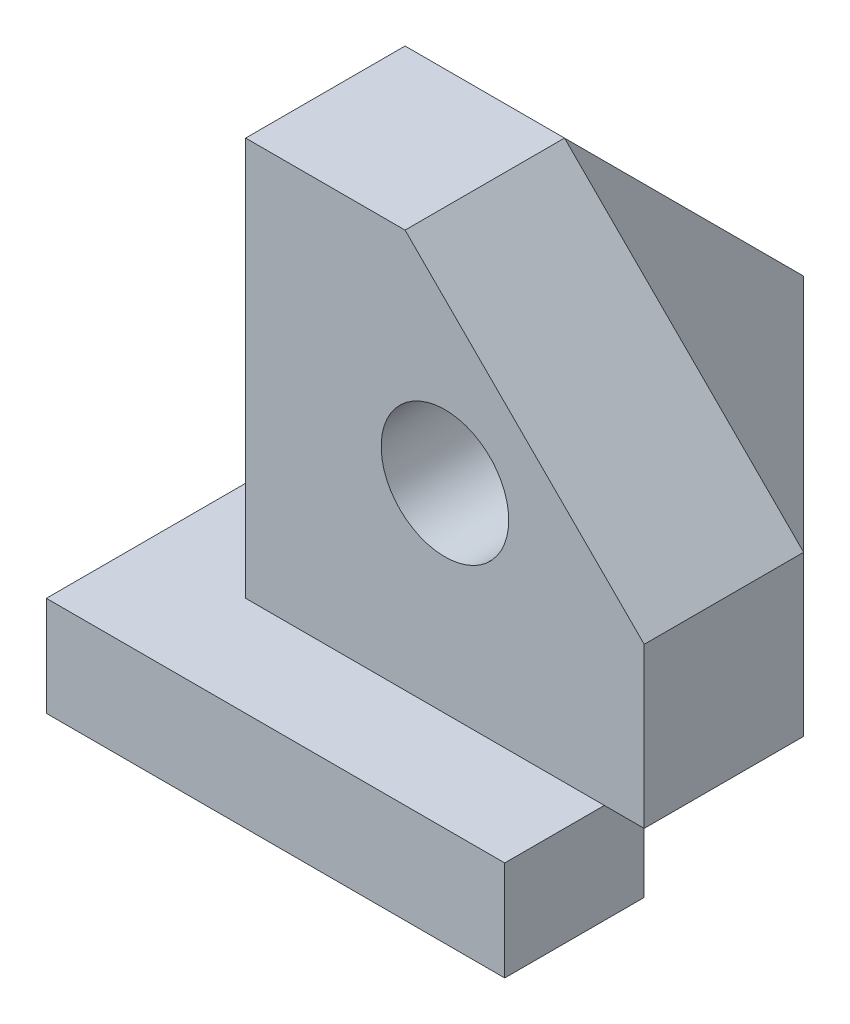
ISO-10303-21;
HEADER;
FILE_DESCRIPTION(('STEP AP214'),'2;1');
FILE_NAME('part.step','',(''),(''),'','','');
FILE_SCHEMA(('AUTOMOTIVE_DESIGN { 1 0 10303 214 1 1 1 1 }'));
ENDSEC;
DATA;
#1=APPLICATION_CONTEXT('core data for automotive mechanical design processes');
#2=APPLICATION_PROTOCOL_DEFINITION('international standard','automotive_design',2000,#1);
#3=PRODUCT_CONTEXT('',#1,'mechanical');
#4=PRODUCT('Part','Part','',(#3));
#5=PRODUCT_RELATED_PRODUCT_CATEGORY('part','',(#4));
#6=PRODUCT_DEFINITION_FORMATION('','',#4);
#7=PRODUCT_DEFINITION_CONTEXT('part definition',#1,'design');
#8=PRODUCT_DEFINITION('design','',#6,#7);
#9=PRODUCT_DEFINITION_SHAPE('','',#8);
#10=(LENGTH_UNIT() NAMED_UNIT(*) SI_UNIT(.MILLI.,.METRE.));
#11=(NAMED_UNIT(*) PLANE_ANGLE_UNIT() SI_UNIT($,.RADIAN.));
#12=(NAMED_UNIT(*) SI_UNIT($,.STERADIAN.) SOLID_ANGLE_UNIT());
#13=UNCERTAINTY_MEASURE_WITH_UNIT(LENGTH_MEASURE(1.E-05),#10,'distance_accuracy_value','');
#14=(GEOMETRIC_REPRESENTATION_CONTEXT(3) GLOBAL_UNCERTAINTY_ASSIGNED_CONTEXT((#13)) GLOBAL_UNIT_ASSIGNED_CONTEXT((#10,
#11,#12)) REPRESENTATION_CONTEXT('',''));
#15=CARTESIAN_POINT('',(0.,0.,0.));
#16=DIRECTION('',(0.,0.,1.));
#17=DIRECTION('',(1.,0.,0.));
#18=AXIS2_PLACEMENT_3D('',#15,#16,#17);
#19=CARTESIAN_POINT('',(5.,10.,5.));
#20=DIRECTION('',(-1.,0.,0.));
#21=DIRECTION('',(0.,0.,1.));
#22=AXIS2_PLACEMENT_3D('',#19,#20,#21);
#23=PLANE('',#22);
#24=DIRECTION('',(0.,0.,-1.));
#25=VECTOR('',#24,1.);
#26=CARTESIAN_POINT('',(5.,0.,5.));
#27=LINE('',#26,#25);
#28=CARTESIAN_POINT('',(5.,0.,5.));
#29=VERTEX_POINT('',#28);
#30=CARTESIAN_POINT('',(5.,0.,1.));
#31=VERTEX_POINT('',#30);
#32=EDGE_CURVE('E221',#29,#31,#27,.T.);
#33=ORIENTED_EDGE('',*,*,#32,.T.);
#34=DIRECTION('',(0.,1.,0.));
#35=VECTOR('',#34,1.);
#36=CARTESIAN_POINT('',(5.,10.,1.));
#37=LINE('',#36,#35);
#38=CARTESIAN_POINT('',(5.,3.99999999999998,1.));
#39=VERTEX_POINT('',#38);
#40=EDGE_CURVE('E258',#31,#39,#37,.T.);
#41=ORIENTED_EDGE('',*,*,#40,.T.);
#42=DIRECTION('',(0.,0.,1.));
#43=VECTOR('',#42,1.);
#44=CARTESIAN_POINT('',(5.,3.99999999999998,5.));
#45=LINE('',#44,#43);
#46=CARTESIAN_POINT('',(5.,3.99999999999998,5.));
#47=VERTEX_POINT('',#46);
#48=EDGE_CURVE('E256',#39,#47,#45,.T.);
#49=ORIENTED_EDGE('',*,*,#48,.T.);
#50=DIRECTION('',(0.,-1.,0.));
#51=VECTOR('',#50,1.);
#52=CARTESIAN_POINT('',(5.,10.,5.));
#53=LINE('',#52,#51);
#54=EDGE_CURVE('E230',#47,#29,#53,.T.);
#55=ORIENTED_EDGE('',*,*,#54,.T.);
#56=EDGE_LOOP('',(#33,#41,#49,#55));
#57=FACE_BOUND('',#56,.T.);
#58=ADVANCED_FACE('F35',(#57),#23,.F.);
#59=CARTESIAN_POINT('',(-5.,10.,-5.));
#60=DIRECTION('',(0.,0.,1.));
#61=DIRECTION('',(1.,0.,0.));
#62=AXIS2_PLACEMENT_3D('',#59,#60,#61);
#63=PLANE('',#62);
#64=DIRECTION('',(1.,0.,0.));
#65=VECTOR('',#64,1.);
#66=CARTESIAN_POINT('',(-5.,3.99999999999998,-5.));
#67=LINE('',#66,#65);
#68=CARTESIAN_POINT('',(-5.,3.99999999999998,-5.));
#69=VERTEX_POINT('',#68);
#70=CARTESIAN_POINT('',(-1.00000000000002,3.99999999999998,-5.));
#71=VERTEX_POINT('',#70);
#72=EDGE_CURVE('E249',#69,#71,#67,.T.);
#73=ORIENTED_EDGE('',*,*,#72,.T.);
#74=DIRECTION('',(0.,-1.,0.));
#75=VECTOR('',#74,1.);
#76=CARTESIAN_POINT('',(-1.00000000000002,10.,-5.));
#77=LINE('',#76,#75);
#78=CARTESIAN_POINT('',(-1.00000000000002,0.,-5.));
#79=VERTEX_POINT('',#78);
#80=EDGE_CURVE('E251',#71,#79,#77,.T.);
#81=ORIENTED_EDGE('',*,*,#80,.T.);
#82=DIRECTION('',(-1.,0.,0.));
#83=VECTOR('',#82,1.);
#84=CARTESIAN_POINT('',(-5.,0.,-5.));
#85=LINE('',#84,#83);
#86=CARTESIAN_POINT('',(-5.,0.,-5.));
#87=VERTEX_POINT('',#86);
#88=EDGE_CURVE('E233',#79,#87,#85,.T.);
#89=ORIENTED_EDGE('',*,*,#88,.T.);
#90=DIRECTION('',(0.,-1.,0.));
#91=VECTOR('',#90,1.);
#92=CARTESIAN_POINT('',(-5.,10.,-5.));
#93=LINE('',#92,#91);
#94=EDGE_CURVE('E247',#69,#87,#93,.T.);
#95=ORIENTED_EDGE('',*,*,#94,.F.);
#96=EDGE_LOOP('',(#73,#81,#89,#95));
#97=FACE_BOUND('',#96,.T.);
#98=ADVANCED_FACE('F285',(#97),#63,.F.);
#99=CARTESIAN_POINT('',(-5.,10.,5.));
#100=DIRECTION('',(1.,0.,0.));
#101=DIRECTION('',(0.,0.,-1.));
#102=AXIS2_PLACEMENT_3D('',#99,#100,#101);
#103=PLANE('',#102);
#104=CARTESIAN_POINT('',(-5.,5.,0.));
#105=DIRECTION('',(1.,0.,0.));
#106=DIRECTION('',(0.,0.,-1.));
#107=AXIS2_PLACEMENT_3D('',#104,#105,#106);
#108=CIRCLE('',#107,1.6);
#109=CARTESIAN_POINT('',(-5.,5.,-1.6));
#110=VERTEX_POINT('',#109);
#111=EDGE_CURVE('E209',#110,#110,#108,.T.);
#112=ORIENTED_EDGE('',*,*,#111,.T.);
#113=EDGE_LOOP('',(#112));
#114=FACE_BOUND('',#113,.T.);
#115=DIRECTION('',(0.,0.,1.));
#116=VECTOR('',#115,1.);
#117=CARTESIAN_POINT('',(-5.,10.,5.));
#118=LINE('',#117,#116);
#119=CARTESIAN_POINT('',(-5.,10.,1.));
#120=VERTEX_POINT('',#119);
#121=CARTESIAN_POINT('',(-5.,10.,5.));
#122=VERTEX_POINT('',#121);
#123=EDGE_CURVE('E224',#120,#122,#118,.T.);
#124=ORIENTED_EDGE('',*,*,#123,.F.);
#125=DIRECTION('',(0.,0.707106781186549,0.707106781186546));
#126=VECTOR('',#125,1.);
#127=CARTESIAN_POINT('',(-5.,10.,1.));
#128=LINE('',#127,#126);
#129=EDGE_CURVE('E45',#120,#69,#128,.F.);
#130=ORIENTED_EDGE('',*,*,#129,.T.);
#131=ORIENTED_EDGE('',*,*,#94,.T.);
#132=DIRECTION('',(0.,0.,1.));
#133=VECTOR('',#132,1.);
#134=CARTESIAN_POINT('',(-5.,0.,5.));
#135=LINE('',#134,#133);
#136=CARTESIAN_POINT('',(-5.,0.,-4.));
#137=VERTEX_POINT('',#136);
#138=EDGE_CURVE('E237',#87,#137,#135,.T.);
#139=ORIENTED_EDGE('',*,*,#138,.T.);
#140=CARTESIAN_POINT('',(-5.,0.,5.));
#141=VERTEX_POINT('',#140);
#142=EDGE_CURVE('E236',#137,#141,#135,.T.);
#143=ORIENTED_EDGE('',*,*,#142,.T.);
#144=DIRECTION('',(0.,-1.,0.));
#145=VECTOR('',#144,1.);
#146=CARTESIAN_POINT('',(-5.,10.,5.));
#147=LINE('',#146,#145);
#148=EDGE_CURVE('E244',#122,#141,#147,.T.);
#149=ORIENTED_EDGE('',*,*,#148,.F.);
#150=EDGE_LOOP('',(#124,#130,#131,#139,#143,#149));
#151=FACE_BOUND('',#150,.T.);
#152=ADVANCED_FACE('F295',(#114,#151),#103,.F.);
#153=CARTESIAN_POINT('',(-5.,10.,5.));
#154=DIRECTION('',(0.,0.,-1.));
#155=DIRECTION('',(-1.,0.,0.));
#156=AXIS2_PLACEMENT_3D('',#153,#154,#155);
#157=PLANE('',#156);
#158=CARTESIAN_POINT('',(0.,5.,5.));
#159=DIRECTION('',(0.,0.,1.));
#160=DIRECTION('',(1.,0.,0.));
#161=AXIS2_PLACEMENT_3D('',#158,#159,#160);
#162=CIRCLE('',#161,1.6);
#163=CARTESIAN_POINT('',(1.6,5.,5.));
#164=VERTEX_POINT('',#163);
#165=EDGE_CURVE('E215',#164,#164,#162,.T.);
#166=ORIENTED_EDGE('',*,*,#165,.F.);
#167=EDGE_LOOP('',(#166));
#168=FACE_BOUND('',#167,.T.);
#169=ORIENTED_EDGE('',*,*,#54,.F.);
#170=DIRECTION('',(0.707106781186546,-0.707106781186549,0.));
#171=VECTOR('',#170,1.);
#172=CARTESIAN_POINT('',(-1.,10.,5.));
#173=LINE('',#172,#171);
#174=CARTESIAN_POINT('',(-1.,10.,5.));
#175=VERTEX_POINT('',#174);
#176=EDGE_CURVE('E264',#47,#175,#173,.F.);
#177=ORIENTED_EDGE('',*,*,#176,.T.);
#178=DIRECTION('',(1.,0.,0.));
#179=VECTOR('',#178,1.);
#180=CARTESIAN_POINT('',(-5.,10.,5.));
#181=LINE('',#180,#179);
#182=EDGE_CURVE('E226',#122,#175,#181,.T.);
#183=ORIENTED_EDGE('',*,*,#182,.F.);
#184=ORIENTED_EDGE('',*,*,#148,.T.);
#185=DIRECTION('',(1.,0.,0.));
#186=VECTOR('',#185,1.);
#187=CARTESIAN_POINT('',(-5.,0.,5.));
#188=LINE('',#187,#186);
#189=CARTESIAN_POINT('',(4.,0.,5.));
#190=VERTEX_POINT('',#189);
#191=EDGE_CURVE('E227',#141,#190,#188,.T.);
#192=ORIENTED_EDGE('',*,*,#191,.T.);
#193=EDGE_CURVE('E240',#190,#29,#188,.T.);
#194=ORIENTED_EDGE('',*,*,#193,.T.);
#195=EDGE_LOOP('',(#169,#177,#183,#184,#192,#194));
#196=FACE_BOUND('',#195,.T.);
#197=ADVANCED_FACE('F314',(#168,#196),#157,.F.);
#198=CARTESIAN_POINT('',(0.,10.,0.));
#199=DIRECTION('',(0.,-1.,0.));
#200=DIRECTION('',(0.,0.,-1.));
#201=AXIS2_PLACEMENT_3D('',#198,#199,#200);
#202=PLANE('',#201);
#203=ORIENTED_EDGE('',*,*,#182,.T.);
#204=DIRECTION('',(0.,0.,-1.));
#205=VECTOR('',#204,1.);
#206=CARTESIAN_POINT('',(-1.,10.,0.));
#207=LINE('',#206,#205);
#208=CARTESIAN_POINT('',(-1.,10.,1.));
#209=VERTEX_POINT('',#208);
#210=EDGE_CURVE('E262',#175,#209,#207,.T.);
#211=ORIENTED_EDGE('',*,*,#210,.T.);
#212=DIRECTION('',(-1.,0.,0.));
#213=VECTOR('',#212,1.);
#214=CARTESIAN_POINT('',(0.,10.,1.));
#215=LINE('',#214,#213);
#216=EDGE_CURVE('E260',#209,#120,#215,.T.);
#217=ORIENTED_EDGE('',*,*,#216,.T.);
#218=ORIENTED_EDGE('',*,*,#123,.T.);
#219=EDGE_LOOP('',(#203,#211,#217,#218));
#220=FACE_BOUND('',#219,.T.);
#221=ADVANCED_FACE('F319',(#220),#202,.F.);
#222=CARTESIAN_POINT('',(0.,0.,0.));
#223=DIRECTION('',(0.,-1.,0.));
#224=DIRECTION('',(0.,0.,-1.));
#225=AXIS2_PLACEMENT_3D('',#222,#223,#224);
#226=PLANE('',#225);
#227=DIRECTION('',(1.,0.,0.));
#228=VECTOR('',#227,1.);
#229=CARTESIAN_POINT('',(-7.5,0.,-4.));
#230=LINE('',#229,#228);
#231=CARTESIAN_POINT('',(-4.,0.,-4.));
#232=VERTEX_POINT('',#231);
#233=EDGE_CURVE('E11',#137,#232,#230,.T.);
#234=ORIENTED_EDGE('',*,*,#233,.F.);
#235=ORIENTED_EDGE('',*,*,#138,.F.);
#236=ORIENTED_EDGE('',*,*,#88,.F.);
#237=DIRECTION('',(-0.707106781186549,0.,-0.707106781186546));
#238=VECTOR('',#237,1.);
#239=CARTESIAN_POINT('',(1.99999999999999,0.,-2.));
#240=LINE('',#239,#238);
#241=EDGE_CURVE('E254',#79,#31,#240,.F.);
#242=ORIENTED_EDGE('',*,*,#241,.T.);
#243=ORIENTED_EDGE('',*,*,#32,.F.);
#244=ORIENTED_EDGE('',*,*,#193,.F.);
#245=DIRECTION('',(0.,0.,1.));
#246=VECTOR('',#245,1.);
#247=CARTESIAN_POINT('',(4.,0.,4.));
#248=LINE('',#247,#246);
#249=CARTESIAN_POINT('',(4.,0.,4.));
#250=VERTEX_POINT('',#249);
#251=EDGE_CURVE('E148',#250,#190,#248,.T.);
#252=ORIENTED_EDGE('',*,*,#251,.F.);
#253=DIRECTION('',(1.,0.,0.));
#254=VECTOR('',#253,1.);
#255=CARTESIAN_POINT('',(0.,0.,4.));
#256=LINE('',#255,#254);
#257=CARTESIAN_POINT('',(0.,0.,4.));
#258=VERTEX_POINT('',#257);
#259=EDGE_CURVE('E152',#258,#250,#256,.T.);
#260=ORIENTED_EDGE('',*,*,#259,.F.);
#261=CARTESIAN_POINT('',(0.,0.,0.));
#262=DIRECTION('',(0.,1.,0.));
#263=DIRECTION('',(0.,0.,-1.));
#264=AXIS2_PLACEMENT_3D('',#261,#262,#263);
#265=CIRCLE('',#264,4.);
#266=CARTESIAN_POINT('',(-4.,0.,0.));
#267=VERTEX_POINT('',#266);
#268=EDGE_CURVE('E58',#267,#258,#265,.T.);
#269=ORIENTED_EDGE('',*,*,#268,.F.);
#270=DIRECTION('',(0.,0.,1.));
#271=VECTOR('',#270,1.);
#272=CARTESIAN_POINT('',(-4.,0.,0.));
#273=LINE('',#272,#271);
#274=EDGE_CURVE('E54',#232,#267,#273,.T.);
#275=ORIENTED_EDGE('',*,*,#274,.F.);
#276=EDGE_LOOP('',(#234,#235,#236,#242,#243,#244,#252,#260,#269,#275));
#277=FACE_BOUND('',#276,.T.);
#278=CARTESIAN_POINT('',(0.,0.,0.));
#279=DIRECTION('',(0.,-1.,0.));
#280=DIRECTION('',(0.,0.,-1.));
#281=AXIS2_PLACEMENT_3D('',#278,#279,#280);
#282=CIRCLE('',#281,1.6);
#283=CARTESIAN_POINT('',(0.,0.,-1.6));
#284=VERTEX_POINT('',#283);
#285=EDGE_CURVE('E208',#284,#284,#282,.T.);
#286=ORIENTED_EDGE('',*,*,#285,.F.);
#287=EDGE_LOOP('',(#286));
#288=FACE_BOUND('',#287,.T.);
#289=ADVANCED_FACE('F289',(#277,#288),#226,.T.);
#290=CARTESIAN_POINT('',(0.,5.,1.8));
#291=DIRECTION('',(0.,0.,1.));
#292=DIRECTION('',(1.,0.,0.));
#293=AXIS2_PLACEMENT_3D('',#290,#291,#292);
#294=CYLINDRICAL_SURFACE('',#293,1.6);
#295=CARTESIAN_POINT('',(0.,5.,1.8));
#296=DIRECTION('',(0.,0.,1.));
#297=DIRECTION('',(1.,0.,0.));
#298=AXIS2_PLACEMENT_3D('',#295,#296,#297);
#299=CIRCLE('',#298,1.6);
#300=CARTESIAN_POINT('',(1.6,5.,1.8));
#301=VERTEX_POINT('',#300);
#302=EDGE_CURVE('E218',#301,#301,#299,.T.);
#303=ORIENTED_EDGE('',*,*,#302,.F.);
#304=EDGE_LOOP('',(#303));
#305=FACE_BOUND('',#304,.T.);
#306=ORIENTED_EDGE('',*,*,#165,.T.);
#307=EDGE_LOOP('',(#306));
#308=FACE_BOUND('',#307,.T.);
#309=ADVANCED_FACE('F383',(#305,#308),#294,.F.);
#310=CARTESIAN_POINT('',(0.,5.,1.8));
#311=DIRECTION('',(0.,0.,1.));
#312=DIRECTION('',(1.,0.,0.));
#313=AXIS2_PLACEMENT_3D('',#310,#311,#312);
#314=PLANE('',#313);
#315=ORIENTED_EDGE('',*,*,#302,.T.);
#316=EDGE_LOOP('',(#315));
#317=FACE_BOUND('',#316,.T.);
#318=ADVANCED_FACE('F379',(#317),#314,.T.);
#319=CARTESIAN_POINT('',(0.,3.2,0.));
#320=DIRECTION('',(0.,-1.,0.));
#321=DIRECTION('',(0.,0.,-1.));
#322=AXIS2_PLACEMENT_3D('',#319,#320,#321);
#323=CYLINDRICAL_SURFACE('',#322,1.6);
#324=CARTESIAN_POINT('',(0.,3.2,0.));
#325=DIRECTION('',(0.,-1.,0.));
#326=DIRECTION('',(0.,0.,-1.));
#327=AXIS2_PLACEMENT_3D('',#324,#325,#326);
#328=CIRCLE('',#327,1.6);
#329=CARTESIAN_POINT('',(0.,3.2,-1.6));
#330=VERTEX_POINT('',#329);
#331=EDGE_CURVE('E212',#330,#330,#328,.T.);
#332=ORIENTED_EDGE('',*,*,#331,.F.);
#333=EDGE_LOOP('',(#332));
#334=FACE_BOUND('',#333,.T.);
#335=ORIENTED_EDGE('',*,*,#285,.T.);
#336=EDGE_LOOP('',(#335));
#337=FACE_BOUND('',#336,.T.);
#338=ADVANCED_FACE('F375',(#334,#337),#323,.F.);
#339=CARTESIAN_POINT('',(0.,3.2,0.));
#340=DIRECTION('',(0.,-1.,0.));
#341=DIRECTION('',(0.,0.,-1.));
#342=AXIS2_PLACEMENT_3D('',#339,#340,#341);
#343=PLANE('',#342);
#344=ORIENTED_EDGE('',*,*,#331,.T.);
#345=EDGE_LOOP('',(#344));
#346=FACE_BOUND('',#345,.T.);
#347=ADVANCED_FACE('F371',(#346),#343,.T.);
#348=CARTESIAN_POINT('',(-1.8,5.,0.));
#349=DIRECTION('',(-1.,0.,0.));
#350=DIRECTION('',(0.,0.,1.));
#351=AXIS2_PLACEMENT_3D('',#348,#349,#350);
#352=CYLINDRICAL_SURFACE('',#351,1.6);
#353=CARTESIAN_POINT('',(-1.8,5.,0.));
#354=DIRECTION('',(1.,0.,0.));
#355=DIRECTION('',(0.,0.,-1.));
#356=AXIS2_PLACEMENT_3D('',#353,#354,#355);
#357=CIRCLE('',#356,1.6);
#358=CARTESIAN_POINT('',(-1.8,5.,-1.6));
#359=VERTEX_POINT('',#358);
#360=EDGE_CURVE('E205',#359,#359,#357,.T.);
#361=ORIENTED_EDGE('',*,*,#360,.T.);
#362=EDGE_LOOP('',(#361));
#363=FACE_BOUND('',#362,.T.);
#364=ORIENTED_EDGE('',*,*,#111,.F.);
#365=EDGE_LOOP('',(#364));
#366=FACE_BOUND('',#365,.T.);
#367=ADVANCED_FACE('F367',(#363,#366),#352,.F.);
#368=CARTESIAN_POINT('',(-1.8,5.,0.));
#369=DIRECTION('',(1.,0.,0.));
#370=DIRECTION('',(0.,0.,-1.));
#371=AXIS2_PLACEMENT_3D('',#368,#369,#370);
#372=PLANE('',#371);
#373=ORIENTED_EDGE('',*,*,#360,.F.);
#374=EDGE_LOOP('',(#373));
#375=FACE_BOUND('',#374,.T.);
#376=ADVANCED_FACE('F330',(#375),#372,.F.);
#377=CARTESIAN_POINT('',(-1.,10.,0.));
#378=DIRECTION('',(-0.707106781186549,-0.707106781186546,0.));
#379=DIRECTION('',(0.,0.,-1.));
#380=AXIS2_PLACEMENT_3D('',#377,#378,#379);
#381=PLANE('',#380);
#382=ORIENTED_EDGE('',*,*,#176,.F.);
#383=ORIENTED_EDGE('',*,*,#48,.F.);
#384=DIRECTION('',(-0.707106781186546,0.707106781186549,0.));
#385=VECTOR('',#384,1.);
#386=CARTESIAN_POINT('',(5.,3.99999999999998,1.));
#387=LINE('',#386,#385);
#388=EDGE_CURVE('E40',#209,#39,#387,.F.);
#389=ORIENTED_EDGE('',*,*,#388,.F.);
#390=ORIENTED_EDGE('',*,*,#210,.F.);
#391=EDGE_LOOP('',(#382,#383,#389,#390));
#392=FACE_BOUND('',#391,.T.);
#393=ADVANCED_FACE('F38',(#392),#381,.F.);
#394=CARTESIAN_POINT('',(0.,10.,1.));
#395=DIRECTION('',(0.,-0.707106781186546,0.707106781186549));
#396=DIRECTION('',(-1.,0.,0.));
#397=AXIS2_PLACEMENT_3D('',#394,#395,#396);
#398=PLANE('',#397);
#399=ORIENTED_EDGE('',*,*,#129,.F.);
#400=ORIENTED_EDGE('',*,*,#216,.F.);
#401=DIRECTION('',(0.,-0.707106781186549,-0.707106781186546));
#402=VECTOR('',#401,1.);
#403=CARTESIAN_POINT('',(-1.00000000000001,6.99999999999999,-2.));
#404=LINE('',#403,#402);
#405=EDGE_CURVE('E268',#71,#209,#404,.F.);
#406=ORIENTED_EDGE('',*,*,#405,.F.);
#407=ORIENTED_EDGE('',*,*,#72,.F.);
#408=EDGE_LOOP('',(#399,#400,#406,#407));
#409=FACE_BOUND('',#408,.T.);
#410=ADVANCED_FACE('F323',(#409),#398,.F.);
#411=CARTESIAN_POINT('',(5.,3.99999999999998,1.));
#412=DIRECTION('',(0.577350269189626,0.577350269189624,-0.577350269189628));
#413=DIRECTION('',(-0.707106781186549,0.,-0.707106781186546));
#414=AXIS2_PLACEMENT_3D('',#411,#412,#413);
#415=PLANE('',#414);
#416=ORIENTED_EDGE('',*,*,#405,.T.);
#417=ORIENTED_EDGE('',*,*,#388,.T.);
#418=DIRECTION('',(0.707106781186549,0.,0.707106781186546));
#419=VECTOR('',#418,1.);
#420=CARTESIAN_POINT('',(5.,3.99999999999998,1.));
#421=LINE('',#420,#419);
#422=EDGE_CURVE('E196',#71,#39,#421,.T.);
#423=ORIENTED_EDGE('',*,*,#422,.F.);
#424=EDGE_LOOP('',(#416,#417,#423));
#425=FACE_BOUND('',#424,.T.);
#426=ADVANCED_FACE('F275',(#425),#415,.T.);
#427=CARTESIAN_POINT('',(-1.00000000000002,10.,-5.));
#428=DIRECTION('',(-0.707106781186546,0.,0.707106781186549));
#429=DIRECTION('',(0.,-1.,0.));
#430=AXIS2_PLACEMENT_3D('',#427,#428,#429);
#431=PLANE('',#430);
#432=ORIENTED_EDGE('',*,*,#422,.T.);
#433=ORIENTED_EDGE('',*,*,#40,.F.);
#434=ORIENTED_EDGE('',*,*,#241,.F.);
#435=ORIENTED_EDGE('',*,*,#80,.F.);
#436=EDGE_LOOP('',(#432,#433,#434,#435));
#437=FACE_BOUND('',#436,.T.);
#438=ADVANCED_FACE('F282',(#437),#431,.F.);
#439=CARTESIAN_POINT('',(0.,0.,4.));
#440=DIRECTION('',(0.,0.,-1.));
#441=DIRECTION('',(-1.,0.,0.));
#442=AXIS2_PLACEMENT_3D('',#439,#440,#441);
#443=PLANE('',#442);
#444=DIRECTION('',(1.,0.,0.));
#445=VECTOR('',#444,1.);
#446=CARTESIAN_POINT('',(0.,-2.5,4.));
#447=LINE('',#446,#445);
#448=CARTESIAN_POINT('',(0.,-2.5,4.));
#449=VERTEX_POINT('',#448);
#450=CARTESIAN_POINT('',(4.,-2.5,4.));
#451=VERTEX_POINT('',#450);
#452=EDGE_CURVE('E176',#449,#451,#447,.T.);
#453=ORIENTED_EDGE('',*,*,#452,.F.);
#454=DIRECTION('',(0.,-1.,0.));
#455=VECTOR('',#454,1.);
#456=CARTESIAN_POINT('',(0.,0.,4.));
#457=LINE('',#456,#455);
#458=EDGE_CURVE('E194',#258,#449,#457,.T.);
#459=ORIENTED_EDGE('',*,*,#458,.F.);
#460=ORIENTED_EDGE('',*,*,#259,.T.);
#461=DIRECTION('',(0.,-1.,0.));
#462=VECTOR('',#461,1.);
#463=CARTESIAN_POINT('',(4.,0.,4.));
#464=LINE('',#463,#462);
#465=EDGE_CURVE('E162',#250,#451,#464,.T.);
#466=ORIENTED_EDGE('',*,*,#465,.T.);
#467=EDGE_LOOP('',(#453,#459,#460,#466));
#468=FACE_BOUND('',#467,.T.);
#469=ADVANCED_FACE('F310',(#468),#443,.T.);
#470=CARTESIAN_POINT('',(0.,0.,0.));
#471=DIRECTION('',(0.,-1.,0.));
#472=DIRECTION('',(0.,0.,-1.));
#473=AXIS2_PLACEMENT_3D('',#470,#471,#472);
#474=CYLINDRICAL_SURFACE('',#473,4.);
#475=CARTESIAN_POINT('',(0.,-2.5,0.));
#476=DIRECTION('',(0.,1.,0.));
#477=DIRECTION('',(0.,0.,-1.));
#478=AXIS2_PLACEMENT_3D('',#475,#476,#477);
#479=CIRCLE('',#478,4.);
#480=CARTESIAN_POINT('',(-4.,-2.5,0.));
#481=VERTEX_POINT('',#480);
#482=EDGE_CURVE('E191',#481,#449,#479,.T.);
#483=ORIENTED_EDGE('',*,*,#482,.F.);
#484=DIRECTION('',(0.,-1.,0.));
#485=VECTOR('',#484,1.);
#486=CARTESIAN_POINT('',(-4.,0.,0.));
#487=LINE('',#486,#485);
#488=EDGE_CURVE('E197',#267,#481,#487,.T.);
#489=ORIENTED_EDGE('',*,*,#488,.F.);
#490=ORIENTED_EDGE('',*,*,#268,.T.);
#491=ORIENTED_EDGE('',*,*,#458,.T.);
#492=EDGE_LOOP('',(#483,#489,#490,#491));
#493=FACE_BOUND('',#492,.T.);
#494=ADVANCED_FACE('F354',(#493),#474,.F.);
#495=CARTESIAN_POINT('',(-4.,0.,0.));
#496=DIRECTION('',(1.,0.,0.));
#497=DIRECTION('',(0.,0.,-1.));
#498=AXIS2_PLACEMENT_3D('',#495,#496,#497);
#499=PLANE('',#498);
#500=DIRECTION('',(0.,0.,1.));
#501=VECTOR('',#500,1.);
#502=CARTESIAN_POINT('',(-4.,-2.5,0.));
#503=LINE('',#502,#501);
#504=CARTESIAN_POINT('',(-4.,-2.5,-4.));
#505=VERTEX_POINT('',#504);
#506=EDGE_CURVE('E188',#505,#481,#503,.T.);
#507=ORIENTED_EDGE('',*,*,#506,.F.);
#508=DIRECTION('',(0.,-1.,0.));
#509=VECTOR('',#508,1.);
#510=CARTESIAN_POINT('',(-4.,0.,-4.));
#511=LINE('',#510,#509);
#512=EDGE_CURVE('E199',#232,#505,#511,.T.);
#513=ORIENTED_EDGE('',*,*,#512,.F.);
#514=ORIENTED_EDGE('',*,*,#274,.T.);
#515=ORIENTED_EDGE('',*,*,#488,.T.);
#516=EDGE_LOOP('',(#507,#513,#514,#515));
#517=FACE_BOUND('',#516,.T.);
#518=ADVANCED_FACE('F359',(#517),#499,.T.);
#519=CARTESIAN_POINT('',(-7.5,0.,-4.));
#520=DIRECTION('',(0.,0.,-1.));
#521=DIRECTION('',(-1.,0.,0.));
#522=AXIS2_PLACEMENT_3D('',#519,#520,#521);
#523=PLANE('',#522);
#524=DIRECTION('',(1.,0.,0.));
#525=VECTOR('',#524,1.);
#526=CARTESIAN_POINT('',(-7.5,-2.5,-4.));
#527=LINE('',#526,#525);
#528=CARTESIAN_POINT('',(-7.5,-2.5,-4.));
#529=VERTEX_POINT('',#528);
#530=EDGE_CURVE('E185',#529,#505,#527,.T.);
#531=ORIENTED_EDGE('',*,*,#530,.F.);
#532=DIRECTION('',(0.,-1.,0.));
#533=VECTOR('',#532,1.);
#534=CARTESIAN_POINT('',(-7.5,0.,-4.));
#535=LINE('',#534,#533);
#536=CARTESIAN_POINT('',(-7.5,0.,-4.));
#537=VERTEX_POINT('',#536);
#538=EDGE_CURVE('E201',#537,#529,#535,.T.);
#539=ORIENTED_EDGE('',*,*,#538,.F.);
#540=EDGE_CURVE('E47',#537,#137,#230,.T.);
#541=ORIENTED_EDGE('',*,*,#540,.T.);
#542=ORIENTED_EDGE('',*,*,#233,.T.);
#543=ORIENTED_EDGE('',*,*,#512,.T.);
#544=EDGE_LOOP('',(#531,#539,#541,#542,#543));
#545=FACE_BOUND('',#544,.T.);
#546=ADVANCED_FACE('F299',(#545),#523,.T.);
#547=CARTESIAN_POINT('',(-7.5,0.,7.5));
#548=DIRECTION('',(-1.,0.,0.));
#549=DIRECTION('',(0.,0.,1.));
#550=AXIS2_PLACEMENT_3D('',#547,#548,#549);
#551=PLANE('',#550);
#552=DIRECTION('',(0.,0.,-1.));
#553=VECTOR('',#552,1.);
#554=CARTESIAN_POINT('',(-7.5,-2.5,7.5));
#555=LINE('',#554,#553);
#556=CARTESIAN_POINT('',(-7.5,-2.5,7.5));
#557=VERTEX_POINT('',#556);
#558=EDGE_CURVE('E182',#557,#529,#555,.T.);
#559=ORIENTED_EDGE('',*,*,#558,.F.);
#560=DIRECTION('',(0.,-1.,0.));
#561=VECTOR('',#560,1.);
#562=CARTESIAN_POINT('',(-7.5,0.,7.5));
#563=LINE('',#562,#561);
#564=CARTESIAN_POINT('',(-7.5,0.,7.5));
#565=VERTEX_POINT('',#564);
#566=EDGE_CURVE('E161',#565,#557,#563,.T.);
#567=ORIENTED_EDGE('',*,*,#566,.F.);
#568=DIRECTION('',(0.,0.,-1.));
#569=VECTOR('',#568,1.);
#570=CARTESIAN_POINT('',(-7.5,0.,7.5));
#571=LINE('',#570,#569);
#572=EDGE_CURVE('E168',#565,#537,#571,.T.);
#573=ORIENTED_EDGE('',*,*,#572,.T.);
#574=ORIENTED_EDGE('',*,*,#538,.T.);
#575=EDGE_LOOP('',(#559,#567,#573,#574));
#576=FACE_BOUND('',#575,.T.);
#577=ADVANCED_FACE('F303',(#576),#551,.T.);
#578=CARTESIAN_POINT('',(4.,0.,7.5));
#579=DIRECTION('',(0.,0.,1.));
#580=DIRECTION('',(1.,0.,0.));
#581=AXIS2_PLACEMENT_3D('',#578,#579,#580);
#582=PLANE('',#581);
#583=DIRECTION('',(-1.,0.,0.));
#584=VECTOR('',#583,1.);
#585=CARTESIAN_POINT('',(4.,-2.5,7.5));
#586=LINE('',#585,#584);
#587=CARTESIAN_POINT('',(4.,-2.5,7.5));
#588=VERTEX_POINT('',#587);
#589=EDGE_CURVE('E159',#588,#557,#586,.T.);
#590=ORIENTED_EDGE('',*,*,#589,.F.);
#591=DIRECTION('',(0.,-1.,0.));
#592=VECTOR('',#591,1.);
#593=CARTESIAN_POINT('',(4.,0.,7.5));
#594=LINE('',#593,#592);
#595=CARTESIAN_POINT('',(4.,0.,7.5));
#596=VERTEX_POINT('',#595);
#597=EDGE_CURVE('E145',#596,#588,#594,.T.);
#598=ORIENTED_EDGE('',*,*,#597,.F.);
#599=DIRECTION('',(-1.,0.,0.));
#600=VECTOR('',#599,1.);
#601=CARTESIAN_POINT('',(4.,0.,7.5));
#602=LINE('',#601,#600);
#603=EDGE_CURVE('E157',#596,#565,#602,.T.);
#604=ORIENTED_EDGE('',*,*,#603,.T.);
#605=ORIENTED_EDGE('',*,*,#566,.T.);
#606=EDGE_LOOP('',(#590,#598,#604,#605));
#607=FACE_BOUND('',#606,.T.);
#608=ADVANCED_FACE('F156',(#607),#582,.T.);
#609=CARTESIAN_POINT('',(4.,0.,4.));
#610=DIRECTION('',(1.,0.,0.));
#611=DIRECTION('',(0.,0.,-1.));
#612=AXIS2_PLACEMENT_3D('',#609,#610,#611);
#613=PLANE('',#612);
#614=DIRECTION('',(0.,0.,1.));
#615=VECTOR('',#614,1.);
#616=CARTESIAN_POINT('',(4.,-2.5,4.));
#617=LINE('',#616,#615);
#618=EDGE_CURVE('E179',#451,#588,#617,.T.);
#619=ORIENTED_EDGE('',*,*,#618,.F.);
#620=ORIENTED_EDGE('',*,*,#465,.F.);
#621=ORIENTED_EDGE('',*,*,#251,.T.);
#622=EDGE_CURVE('E141',#190,#596,#248,.T.);
#623=ORIENTED_EDGE('',*,*,#622,.T.);
#624=ORIENTED_EDGE('',*,*,#597,.T.);
#625=EDGE_LOOP('',(#619,#620,#621,#623,#624));
#626=FACE_BOUND('',#625,.T.);
#627=ADVANCED_FACE('F144',(#626),#613,.T.);
#628=CARTESIAN_POINT('',(0.,0.,0.));
#629=DIRECTION('',(0.,-1.,0.));
#630=DIRECTION('',(0.,0.,-1.));
#631=AXIS2_PLACEMENT_3D('',#628,#629,#630);
#632=PLANE('',#631);
#633=ORIENTED_EDGE('',*,*,#191,.F.);
#634=ORIENTED_EDGE('',*,*,#142,.F.);
#635=ORIENTED_EDGE('',*,*,#540,.F.);
#636=ORIENTED_EDGE('',*,*,#572,.F.);
#637=ORIENTED_EDGE('',*,*,#603,.F.);
#638=ORIENTED_EDGE('',*,*,#622,.F.);
#639=EDGE_LOOP('',(#633,#634,#635,#636,#637,#638));
#640=FACE_BOUND('',#639,.T.);
#641=ADVANCED_FACE('F165',(#640),#632,.F.);
#642=CARTESIAN_POINT('',(0.,-2.5,0.));
#643=DIRECTION('',(0.,-1.,0.));
#644=DIRECTION('',(0.,0.,-1.));
#645=AXIS2_PLACEMENT_3D('',#642,#643,#644);
#646=PLANE('',#645);
#647=ORIENTED_EDGE('',*,*,#452,.T.);
#648=ORIENTED_EDGE('',*,*,#618,.T.);
#649=ORIENTED_EDGE('',*,*,#589,.T.);
#650=ORIENTED_EDGE('',*,*,#558,.T.);
#651=ORIENTED_EDGE('',*,*,#530,.T.);
#652=ORIENTED_EDGE('',*,*,#506,.T.);
#653=ORIENTED_EDGE('',*,*,#482,.T.);
#654=EDGE_LOOP('',(#647,#648,#649,#650,#651,#652,#653));
#655=FACE_BOUND('',#654,.T.);
#656=ADVANCED_FACE('F305',(#655),#646,.T.);
#657=CLOSED_SHELL('',(#58,#98,#152,#197,#221,#289,#309,#318,#338,#347,#367,#376,#393,#410,#426,
#438,#469,#494,#518,#546,#577,#608,#627,#641,#656));
#658=MANIFOLD_SOLID_BREP('B2',#657);
#659=ADVANCED_BREP_SHAPE_REPRESENTATION('',(#18,#658),#14);
#660=SHAPE_DEFINITION_REPRESENTATION(#9,#659);
ENDSEC;
END-ISO-10303-21;
